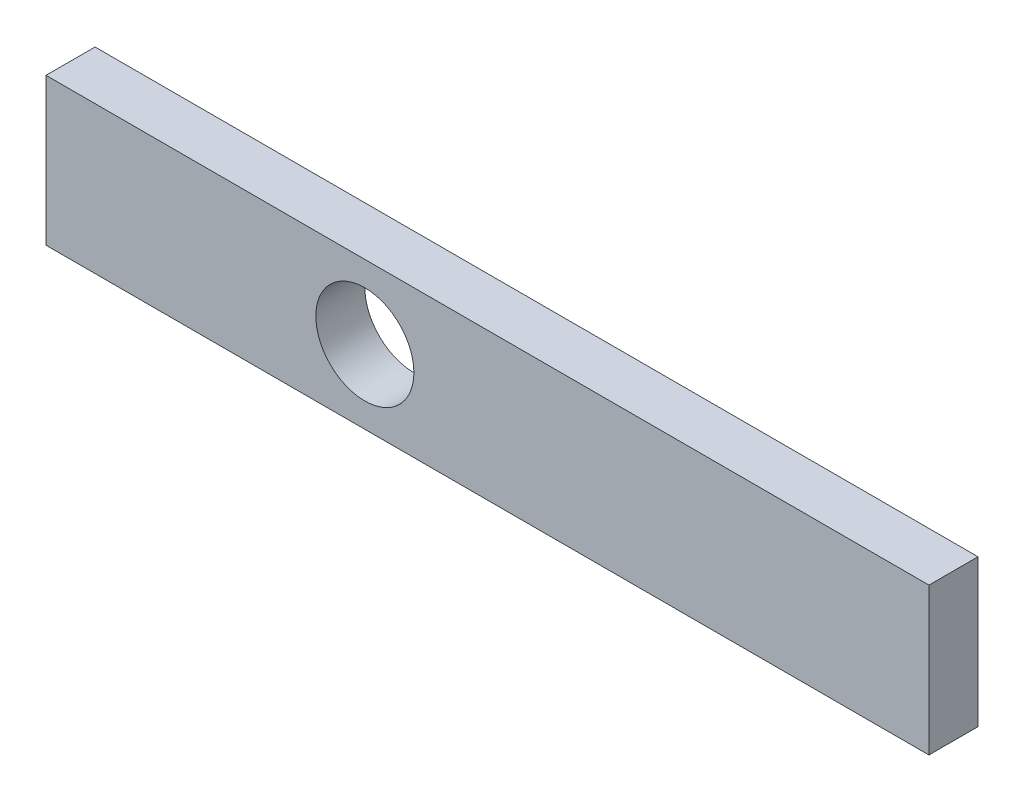
ISO-10303-21;
HEADER;
FILE_DESCRIPTION(('STEP AP214'),'2;1');
FILE_NAME('part.step','',(''),(''),'','','');
FILE_SCHEMA(('AUTOMOTIVE_DESIGN { 1 0 10303 214 1 1 1 1 }'));
ENDSEC;
DATA;
#1=APPLICATION_CONTEXT('core data for automotive mechanical design processes');
#2=APPLICATION_PROTOCOL_DEFINITION('international standard','automotive_design',2000,#1);
#3=PRODUCT_CONTEXT('',#1,'mechanical');
#4=PRODUCT('Part','Part','',(#3));
#5=PRODUCT_RELATED_PRODUCT_CATEGORY('part','',(#4));
#6=PRODUCT_DEFINITION_FORMATION('','',#4);
#7=PRODUCT_DEFINITION_CONTEXT('part definition',#1,'design');
#8=PRODUCT_DEFINITION('design','',#6,#7);
#9=PRODUCT_DEFINITION_SHAPE('','',#8);
#10=(LENGTH_UNIT() NAMED_UNIT(*) SI_UNIT(.MILLI.,.METRE.));
#11=(NAMED_UNIT(*) PLANE_ANGLE_UNIT() SI_UNIT($,.RADIAN.));
#12=(NAMED_UNIT(*) SI_UNIT($,.STERADIAN.) SOLID_ANGLE_UNIT());
#13=UNCERTAINTY_MEASURE_WITH_UNIT(LENGTH_MEASURE(1.E-05),#10,'distance_accuracy_value','');
#14=(GEOMETRIC_REPRESENTATION_CONTEXT(3) GLOBAL_UNCERTAINTY_ASSIGNED_CONTEXT((#13)) GLOBAL_UNIT_ASSIGNED_CONTEXT((#10,
#11,#12)) REPRESENTATION_CONTEXT('',''));
#15=CARTESIAN_POINT('',(0.,0.,0.));
#16=DIRECTION('',(0.,0.,1.));
#17=DIRECTION('',(1.,0.,0.));
#18=AXIS2_PLACEMENT_3D('',#15,#16,#17);
#19=CARTESIAN_POINT('',(-89.9999999999999,-15.,10.));
#20=DIRECTION('',(0.,0.,-1.));
#21=DIRECTION('',(-1.,0.,0.));
#22=AXIS2_PLACEMENT_3D('',#19,#20,#21);
#23=PLANE('',#22);
#24=DIRECTION('',(0.,-1.,0.));
#25=VECTOR('',#24,1.);
#26=CARTESIAN_POINT('',(-90.,15.,10.));
#27=LINE('',#26,#25);
#28=CARTESIAN_POINT('',(-90.,15.,10.));
#29=VERTEX_POINT('',#28);
#30=CARTESIAN_POINT('',(-90.,-15.,10.));
#31=VERTEX_POINT('',#30);
#32=EDGE_CURVE('E85',#29,#31,#27,.T.);
#33=ORIENTED_EDGE('',*,*,#32,.T.);
#34=DIRECTION('',(1.,0.,0.));
#35=VECTOR('',#34,1.);
#36=CARTESIAN_POINT('',(90.,-15.,10.));
#37=LINE('',#36,#35);
#38=CARTESIAN_POINT('',(90.,-15.,10.));
#39=VERTEX_POINT('',#38);
#40=EDGE_CURVE('E80',#31,#39,#37,.T.);
#41=ORIENTED_EDGE('',*,*,#40,.T.);
#42=DIRECTION('',(0.,1.,0.));
#43=VECTOR('',#42,1.);
#44=CARTESIAN_POINT('',(90.,15.,10.));
#45=LINE('',#44,#43);
#46=CARTESIAN_POINT('',(90.,15.,10.));
#47=VERTEX_POINT('',#46);
#48=EDGE_CURVE('E83',#39,#47,#45,.T.);
#49=ORIENTED_EDGE('',*,*,#48,.T.);
#50=DIRECTION('',(-1.,0.,0.));
#51=VECTOR('',#50,1.);
#52=CARTESIAN_POINT('',(90.,15.,10.));
#53=LINE('',#52,#51);
#54=EDGE_CURVE('E50',#47,#29,#53,.T.);
#55=ORIENTED_EDGE('',*,*,#54,.T.);
#56=EDGE_LOOP('',(#33,#41,#49,#55));
#57=FACE_BOUND('',#56,.T.);
#58=CARTESIAN_POINT('',(-25.,0.,10.));
#59=DIRECTION('',(0.,0.,1.));
#60=DIRECTION('',(1.,0.,0.));
#61=AXIS2_PLACEMENT_3D('',#58,#59,#60);
#62=CIRCLE('',#61,10.);
#63=CARTESIAN_POINT('',(-15.,0.,10.));
#64=VERTEX_POINT('',#63);
#65=EDGE_CURVE('E100',#64,#64,#62,.T.);
#66=ORIENTED_EDGE('',*,*,#65,.F.);
#67=EDGE_LOOP('',(#66));
#68=FACE_BOUND('',#67,.T.);
#69=ADVANCED_FACE('F33',(#57,#68),#23,.F.);
#70=CARTESIAN_POINT('',(-89.9999999999999,-15.,0.));
#71=DIRECTION('',(0.,0.,-1.));
#72=DIRECTION('',(-1.,0.,0.));
#73=AXIS2_PLACEMENT_3D('',#70,#71,#72);
#74=PLANE('',#73);
#75=DIRECTION('',(0.,-1.,0.));
#76=VECTOR('',#75,1.);
#77=CARTESIAN_POINT('',(-90.,15.,0.));
#78=LINE('',#77,#76);
#79=CARTESIAN_POINT('',(-90.,15.,0.));
#80=VERTEX_POINT('',#79);
#81=CARTESIAN_POINT('',(-90.,-15.,0.));
#82=VERTEX_POINT('',#81);
#83=EDGE_CURVE('E97',#80,#82,#78,.T.);
#84=ORIENTED_EDGE('',*,*,#83,.F.);
#85=DIRECTION('',(-1.,0.,0.));
#86=VECTOR('',#85,1.);
#87=CARTESIAN_POINT('',(90.,15.,0.));
#88=LINE('',#87,#86);
#89=CARTESIAN_POINT('',(90.,15.,0.));
#90=VERTEX_POINT('',#89);
#91=EDGE_CURVE('E73',#90,#80,#88,.T.);
#92=ORIENTED_EDGE('',*,*,#91,.F.);
#93=DIRECTION('',(0.,1.,0.));
#94=VECTOR('',#93,1.);
#95=CARTESIAN_POINT('',(90.,15.,0.));
#96=LINE('',#95,#94);
#97=CARTESIAN_POINT('',(90.,-15.,0.));
#98=VERTEX_POINT('',#97);
#99=EDGE_CURVE('E67',#98,#90,#96,.T.);
#100=ORIENTED_EDGE('',*,*,#99,.F.);
#101=DIRECTION('',(1.,0.,0.));
#102=VECTOR('',#101,1.);
#103=CARTESIAN_POINT('',(90.,-15.,0.));
#104=LINE('',#103,#102);
#105=EDGE_CURVE('E89',#82,#98,#104,.T.);
#106=ORIENTED_EDGE('',*,*,#105,.F.);
#107=EDGE_LOOP('',(#84,#92,#100,#106));
#108=FACE_BOUND('',#107,.T.);
#109=CARTESIAN_POINT('',(-25.,0.,0.));
#110=DIRECTION('',(0.,0.,1.));
#111=DIRECTION('',(1.,0.,0.));
#112=AXIS2_PLACEMENT_3D('',#109,#110,#111);
#113=CIRCLE('',#112,10.);
#114=CARTESIAN_POINT('',(-15.,0.,0.));
#115=VERTEX_POINT('',#114);
#116=EDGE_CURVE('E112',#115,#115,#113,.T.);
#117=ORIENTED_EDGE('',*,*,#116,.T.);
#118=EDGE_LOOP('',(#117));
#119=FACE_BOUND('',#118,.T.);
#120=ADVANCED_FACE('F108',(#108,#119),#74,.T.);
#121=CARTESIAN_POINT('',(-90.,15.,10.));
#122=DIRECTION('',(1.,0.,0.));
#123=DIRECTION('',(0.,0.,-1.));
#124=AXIS2_PLACEMENT_3D('',#121,#122,#123);
#125=PLANE('',#124);
#126=ORIENTED_EDGE('',*,*,#83,.T.);
#127=DIRECTION('',(0.,0.,-1.));
#128=VECTOR('',#127,1.);
#129=CARTESIAN_POINT('',(-90.,-15.,10.));
#130=LINE('',#129,#128);
#131=EDGE_CURVE('E11',#31,#82,#130,.T.);
#132=ORIENTED_EDGE('',*,*,#131,.F.);
#133=ORIENTED_EDGE('',*,*,#32,.F.);
#134=DIRECTION('',(0.,0.,-1.));
#135=VECTOR('',#134,1.);
#136=CARTESIAN_POINT('',(-90.,15.,10.));
#137=LINE('',#136,#135);
#138=EDGE_CURVE('E93',#29,#80,#137,.T.);
#139=ORIENTED_EDGE('',*,*,#138,.T.);
#140=EDGE_LOOP('',(#126,#132,#133,#139));
#141=FACE_BOUND('',#140,.T.);
#142=ADVANCED_FACE('F35',(#141),#125,.F.);
#143=CARTESIAN_POINT('',(90.,-15.,10.));
#144=DIRECTION('',(0.,1.,0.));
#145=DIRECTION('',(-1.,0.,0.));
#146=AXIS2_PLACEMENT_3D('',#143,#144,#145);
#147=PLANE('',#146);
#148=ORIENTED_EDGE('',*,*,#105,.T.);
#149=DIRECTION('',(0.,0.,-1.));
#150=VECTOR('',#149,1.);
#151=CARTESIAN_POINT('',(90.,-15.,10.));
#152=LINE('',#151,#150);
#153=EDGE_CURVE('E42',#39,#98,#152,.T.);
#154=ORIENTED_EDGE('',*,*,#153,.F.);
#155=ORIENTED_EDGE('',*,*,#40,.F.);
#156=ORIENTED_EDGE('',*,*,#131,.T.);
#157=EDGE_LOOP('',(#148,#154,#155,#156));
#158=FACE_BOUND('',#157,.T.);
#159=ADVANCED_FACE('F88',(#158),#147,.F.);
#160=CARTESIAN_POINT('',(90.,15.,10.));
#161=DIRECTION('',(-1.,0.,0.));
#162=DIRECTION('',(0.,0.,1.));
#163=AXIS2_PLACEMENT_3D('',#160,#161,#162);
#164=PLANE('',#163);
#165=ORIENTED_EDGE('',*,*,#99,.T.);
#166=DIRECTION('',(0.,0.,-1.));
#167=VECTOR('',#166,1.);
#168=CARTESIAN_POINT('',(90.,15.,10.));
#169=LINE('',#168,#167);
#170=EDGE_CURVE('E90',#47,#90,#169,.T.);
#171=ORIENTED_EDGE('',*,*,#170,.F.);
#172=ORIENTED_EDGE('',*,*,#48,.F.);
#173=ORIENTED_EDGE('',*,*,#153,.T.);
#174=EDGE_LOOP('',(#165,#171,#172,#173));
#175=FACE_BOUND('',#174,.T.);
#176=ADVANCED_FACE('F91',(#175),#164,.F.);
#177=CARTESIAN_POINT('',(90.,15.,10.));
#178=DIRECTION('',(0.,-1.,0.));
#179=DIRECTION('',(1.,0.,0.));
#180=AXIS2_PLACEMENT_3D('',#177,#178,#179);
#181=PLANE('',#180);
#182=ORIENTED_EDGE('',*,*,#91,.T.);
#183=ORIENTED_EDGE('',*,*,#138,.F.);
#184=ORIENTED_EDGE('',*,*,#54,.F.);
#185=ORIENTED_EDGE('',*,*,#170,.T.);
#186=EDGE_LOOP('',(#182,#183,#184,#185));
#187=FACE_BOUND('',#186,.T.);
#188=ADVANCED_FACE('F105',(#187),#181,.F.);
#189=CARTESIAN_POINT('',(-25.,0.,10.));
#190=DIRECTION('',(0.,0.,-1.));
#191=DIRECTION('',(-1.,0.,0.));
#192=AXIS2_PLACEMENT_3D('',#189,#190,#191);
#193=CYLINDRICAL_SURFACE('',#192,10.);
#194=ORIENTED_EDGE('',*,*,#65,.T.);
#195=EDGE_LOOP('',(#194));
#196=FACE_BOUND('',#195,.T.);
#197=ORIENTED_EDGE('',*,*,#116,.F.);
#198=EDGE_LOOP('',(#197));
#199=FACE_BOUND('',#198,.T.);
#200=ADVANCED_FACE('F118',(#196,#199),#193,.F.);
#201=CLOSED_SHELL('',(#69,#120,#142,#159,#176,#188,#200));
#202=MANIFOLD_SOLID_BREP('B2',#201);
#203=ADVANCED_BREP_SHAPE_REPRESENTATION('',(#18,#202),#14);
#204=SHAPE_DEFINITION_REPRESENTATION(#9,#203);
ENDSEC;
END-ISO-10303-21;
